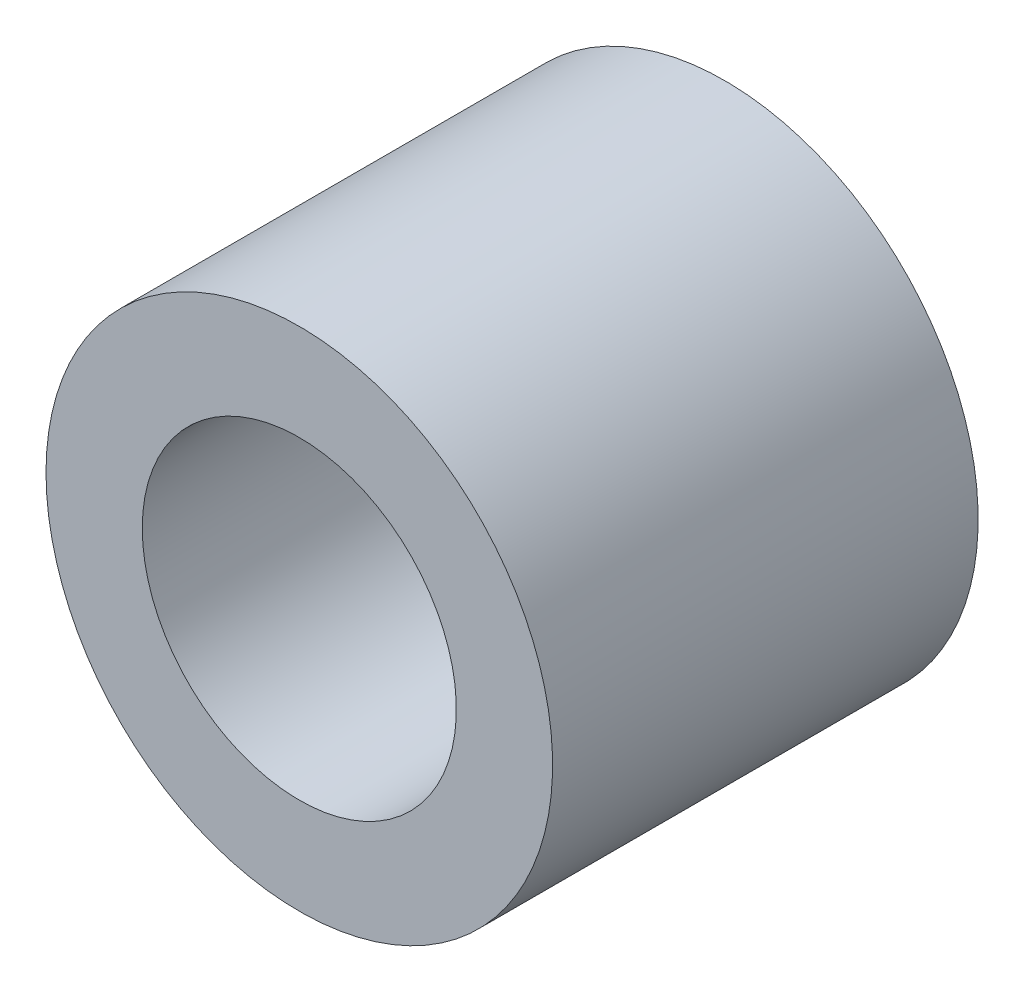
ISO-10303-21;
HEADER;
FILE_DESCRIPTION(('STEP AP214'),'2;1');
FILE_NAME('part.step','',(''),(''),'','','');
FILE_SCHEMA(('AUTOMOTIVE_DESIGN { 1 0 10303 214 1 1 1 1 }'));
ENDSEC;
DATA;
#1=APPLICATION_CONTEXT('core data for automotive mechanical design processes');
#2=APPLICATION_PROTOCOL_DEFINITION('international standard','automotive_design',2000,#1);
#3=PRODUCT_CONTEXT('',#1,'mechanical');
#4=PRODUCT('Part','Part','',(#3));
#5=PRODUCT_RELATED_PRODUCT_CATEGORY('part','',(#4));
#6=PRODUCT_DEFINITION_FORMATION('','',#4);
#7=PRODUCT_DEFINITION_CONTEXT('part definition',#1,'design');
#8=PRODUCT_DEFINITION('design','',#6,#7);
#9=PRODUCT_DEFINITION_SHAPE('','',#8);
#10=(LENGTH_UNIT() NAMED_UNIT(*) SI_UNIT(.MILLI.,.METRE.));
#11=(NAMED_UNIT(*) PLANE_ANGLE_UNIT() SI_UNIT($,.RADIAN.));
#12=(NAMED_UNIT(*) SI_UNIT($,.STERADIAN.) SOLID_ANGLE_UNIT());
#13=UNCERTAINTY_MEASURE_WITH_UNIT(LENGTH_MEASURE(1.E-05),#10,'distance_accuracy_value','');
#14=(GEOMETRIC_REPRESENTATION_CONTEXT(3) GLOBAL_UNCERTAINTY_ASSIGNED_CONTEXT((#13)) GLOBAL_UNIT_ASSIGNED_CONTEXT((#10,
#11,#12)) REPRESENTATION_CONTEXT('',''));
#15=CARTESIAN_POINT('',(0.,0.,0.));
#16=DIRECTION('',(0.,0.,1.));
#17=DIRECTION('',(1.,0.,0.));
#18=AXIS2_PLACEMENT_3D('',#15,#16,#17);
#19=CARTESIAN_POINT('',(11.7232680078392,-79.9392111496469,-7.53455711144125));
#20=DIRECTION('',(0.,0.,1.));
#21=DIRECTION('',(1.,0.,0.));
#22=AXIS2_PLACEMENT_3D('',#19,#20,#21);
#23=CYLINDRICAL_SURFACE('',#22,2.5);
#24=CARTESIAN_POINT('',(11.7232680078392,-79.9392111496469,3.73651070042429));
#25=DIRECTION('',(0.,0.,-1.));
#26=DIRECTION('',(-1.,0.,0.));
#27=AXIS2_PLACEMENT_3D('',#24,#25,#26);
#28=CIRCLE('',#27,2.5);
#29=CARTESIAN_POINT('',(9.2232680078392,-79.9392111496469,3.73651070042429));
#30=VERTEX_POINT('',#29);
#31=EDGE_CURVE('E40',#30,#30,#28,.T.);
#32=ORIENTED_EDGE('',*,*,#31,.T.);
#33=EDGE_LOOP('',(#32));
#34=FACE_BOUND('',#33,.T.);
#35=CARTESIAN_POINT('',(11.7232680078392,-79.9392111496469,-0.463489299575768));
#36=DIRECTION('',(0.,0.,-1.));
#37=DIRECTION('',(-1.,0.,0.));
#38=AXIS2_PLACEMENT_3D('',#35,#36,#37);
#39=CIRCLE('',#38,2.5);
#40=CARTESIAN_POINT('',(9.22326800783919,-79.9392111496469,-0.463489299575768));
#41=VERTEX_POINT('',#40);
#42=EDGE_CURVE('E10',#41,#41,#39,.T.);
#43=ORIENTED_EDGE('',*,*,#42,.F.);
#44=EDGE_LOOP('',(#43));
#45=FACE_BOUND('',#44,.T.);
#46=ADVANCED_FACE('F29',(#34,#45),#23,.T.);
#47=CARTESIAN_POINT('',(11.7232680078392,-79.9392111496469,3.73651070042429));
#48=DIRECTION('',(0.,0.,-1.));
#49=DIRECTION('',(-1.,0.,0.));
#50=AXIS2_PLACEMENT_3D('',#47,#48,#49);
#51=PLANE('',#50);
#52=ORIENTED_EDGE('',*,*,#31,.F.);
#53=EDGE_LOOP('',(#52));
#54=FACE_BOUND('',#53,.T.);
#55=CARTESIAN_POINT('',(11.7232680078392,-79.9392111496469,3.73651070042429));
#56=DIRECTION('',(0.,0.,-1.));
#57=DIRECTION('',(-1.,0.,0.));
#58=AXIS2_PLACEMENT_3D('',#55,#56,#57);
#59=CIRCLE('',#58,1.55);
#60=CARTESIAN_POINT('',(10.1732680078392,-79.9392111496469,3.73651070042429));
#61=VERTEX_POINT('',#60);
#62=EDGE_CURVE('E42',#61,#61,#59,.T.);
#63=ORIENTED_EDGE('',*,*,#62,.T.);
#64=EDGE_LOOP('',(#63));
#65=FACE_BOUND('',#64,.T.);
#66=ADVANCED_FACE('F49',(#54,#65),#51,.F.);
#67=CARTESIAN_POINT('',(11.7232680078392,-79.9392111496469,-7.53455711144125));
#68=DIRECTION('',(0.,0.,1.));
#69=DIRECTION('',(1.,0.,0.));
#70=AXIS2_PLACEMENT_3D('',#67,#68,#69);
#71=CYLINDRICAL_SURFACE('',#70,1.55);
#72=ORIENTED_EDGE('',*,*,#62,.F.);
#73=EDGE_LOOP('',(#72));
#74=FACE_BOUND('',#73,.T.);
#75=CARTESIAN_POINT('',(11.7232680078392,-79.9392111496469,-0.463489299575768));
#76=DIRECTION('',(0.,0.,-1.));
#77=DIRECTION('',(-1.,0.,0.));
#78=AXIS2_PLACEMENT_3D('',#75,#76,#77);
#79=CIRCLE('',#78,1.55);
#80=CARTESIAN_POINT('',(10.1732680078392,-79.9392111496469,-0.463489299575768));
#81=VERTEX_POINT('',#80);
#82=EDGE_CURVE('E32',#81,#81,#79,.T.);
#83=ORIENTED_EDGE('',*,*,#82,.T.);
#84=EDGE_LOOP('',(#83));
#85=FACE_BOUND('',#84,.T.);
#86=ADVANCED_FACE('F52',(#74,#85),#71,.F.);
#87=CARTESIAN_POINT('',(14.9232680078391,-0.66784749771702,-0.463489299575768));
#88=DIRECTION('',(0.,0.,-1.));
#89=DIRECTION('',(-1.,0.,0.));
#90=AXIS2_PLACEMENT_3D('',#87,#88,#89);
#91=PLANE('',#90);
#92=ORIENTED_EDGE('',*,*,#82,.F.);
#93=EDGE_LOOP('',(#92));
#94=FACE_BOUND('',#93,.T.);
#95=ORIENTED_EDGE('',*,*,#42,.T.);
#96=EDGE_LOOP('',(#95));
#97=FACE_BOUND('',#96,.T.);
#98=ADVANCED_FACE('F57',(#94,#97),#91,.T.);
#99=CLOSED_SHELL('',(#46,#66,#86,#98));
#100=MANIFOLD_SOLID_BREP('B2',#99);
#101=ADVANCED_BREP_SHAPE_REPRESENTATION('',(#18,#100),#14);
#102=SHAPE_DEFINITION_REPRESENTATION(#9,#101);
ENDSEC;
END-ISO-10303-21;
